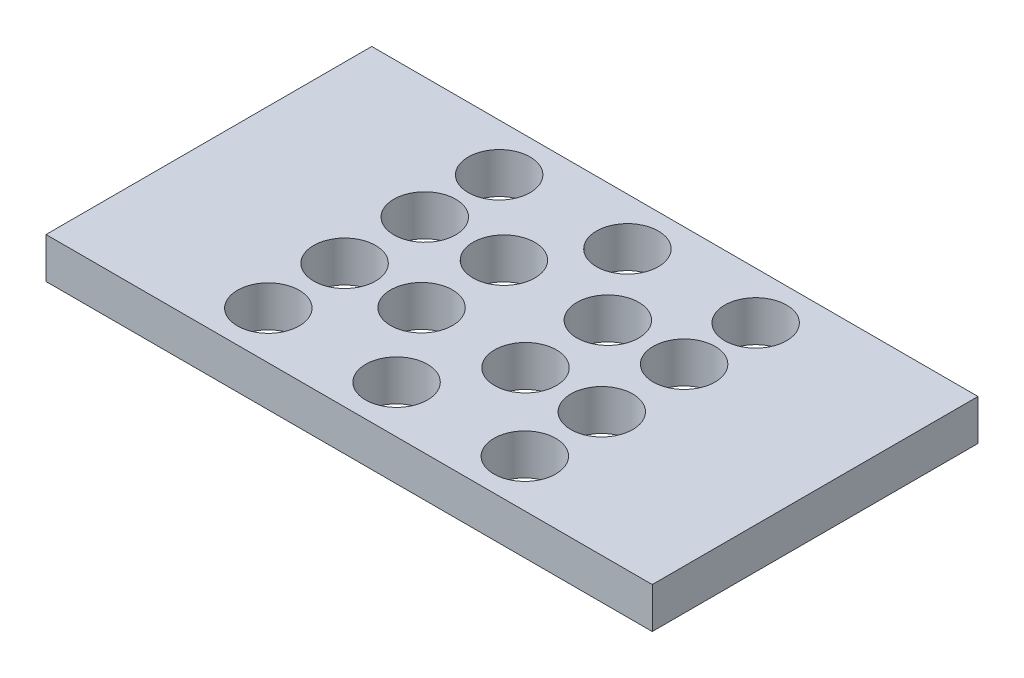
ISO-10303-21;
HEADER;
FILE_DESCRIPTION(('STEP AP214'),'2;1');
FILE_NAME('part.step','',(''),(''),'','','');
FILE_SCHEMA(('AUTOMOTIVE_DESIGN { 1 0 10303 214 1 1 1 1 }'));
ENDSEC;
DATA;
#1=APPLICATION_CONTEXT('core data for automotive mechanical design processes');
#2=APPLICATION_PROTOCOL_DEFINITION('international standard','automotive_design',2000,#1);
#3=PRODUCT_CONTEXT('',#1,'mechanical');
#4=PRODUCT('Part','Part','',(#3));
#5=PRODUCT_RELATED_PRODUCT_CATEGORY('part','',(#4));
#6=PRODUCT_DEFINITION_FORMATION('','',#4);
#7=PRODUCT_DEFINITION_CONTEXT('part definition',#1,'design');
#8=PRODUCT_DEFINITION('design','',#6,#7);
#9=PRODUCT_DEFINITION_SHAPE('','',#8);
#10=(LENGTH_UNIT() NAMED_UNIT(*) SI_UNIT(.MILLI.,.METRE.));
#11=(NAMED_UNIT(*) PLANE_ANGLE_UNIT() SI_UNIT($,.RADIAN.));
#12=(NAMED_UNIT(*) SI_UNIT($,.STERADIAN.) SOLID_ANGLE_UNIT());
#13=UNCERTAINTY_MEASURE_WITH_UNIT(LENGTH_MEASURE(1.E-05),#10,'distance_accuracy_value','');
#14=(GEOMETRIC_REPRESENTATION_CONTEXT(3) GLOBAL_UNCERTAINTY_ASSIGNED_CONTEXT((#13)) GLOBAL_UNIT_ASSIGNED_CONTEXT((#10,
#11,#12)) REPRESENTATION_CONTEXT('',''));
#15=CARTESIAN_POINT('',(0.,0.,0.));
#16=DIRECTION('',(0.,0.,1.));
#17=DIRECTION('',(1.,0.,0.));
#18=AXIS2_PLACEMENT_3D('',#15,#16,#17);
#19=CARTESIAN_POINT('',(0.,6.35,0.));
#20=DIRECTION('',(0.,1.,0.));
#21=DIRECTION('',(0.,0.,1.));
#22=AXIS2_PLACEMENT_3D('',#19,#20,#21);
#23=PLANE('',#22);
#24=CARTESIAN_POINT('',(8.10452389230297,6.35,-6.84402181742708));
#25=DIRECTION('',(0.,1.,0.));
#26=DIRECTION('',(0.,0.,1.));
#27=AXIS2_PLACEMENT_3D('',#24,#25,#26);
#28=CIRCLE('',#27,4.825);
#29=CARTESIAN_POINT('',(8.10452389230297,6.35,-2.01902181742708));
#30=VERTEX_POINT('',#29);
#31=EDGE_CURVE('E222',#30,#30,#28,.T.);
#32=ORIENTED_EDGE('',*,*,#31,.F.);
#33=EDGE_LOOP('',(#32));
#34=FACE_BOUND('',#33,.T.);
#35=CARTESIAN_POINT('',(-20.,6.35,18.0000000000001));
#36=DIRECTION('',(0.,1.,0.));
#37=DIRECTION('',(0.,0.,1.));
#38=AXIS2_PLACEMENT_3D('',#35,#36,#37);
#39=CIRCLE('',#38,4.825);
#40=CARTESIAN_POINT('',(-20.,6.35,22.8250000000001));
#41=VERTEX_POINT('',#40);
#42=EDGE_CURVE('E206',#41,#41,#39,.T.);
#43=ORIENTED_EDGE('',*,*,#42,.F.);
#44=EDGE_LOOP('',(#43));
#45=FACE_BOUND('',#44,.T.);
#46=CARTESIAN_POINT('',(-20.0995004391049,6.35,-6.49683650427019));
#47=DIRECTION('',(0.,1.,0.));
#48=DIRECTION('',(0.,0.,1.));
#49=AXIS2_PLACEMENT_3D('',#46,#47,#48);
#50=CIRCLE('',#49,4.825);
#51=CARTESIAN_POINT('',(-20.0995004391049,6.35,-1.67183650427019));
#52=VERTEX_POINT('',#51);
#53=EDGE_CURVE('E190',#52,#52,#50,.T.);
#54=ORIENTED_EDGE('',*,*,#53,.F.);
#55=EDGE_LOOP('',(#54));
#56=FACE_BOUND('',#55,.T.);
#57=CARTESIAN_POINT('',(20.,6.35,18.));
#58=DIRECTION('',(0.,1.,0.));
#59=DIRECTION('',(0.,0.,1.));
#60=AXIS2_PLACEMENT_3D('',#57,#58,#59);
#61=CIRCLE('',#60,4.825);
#62=CARTESIAN_POINT('',(20.,6.35,22.825));
#63=VERTEX_POINT('',#62);
#64=EDGE_CURVE('E174',#63,#63,#61,.T.);
#65=ORIENTED_EDGE('',*,*,#64,.F.);
#66=EDGE_LOOP('',(#65));
#67=FACE_BOUND('',#66,.T.);
#68=CARTESIAN_POINT('',(20.,6.35,-6.84402181742708));
#69=DIRECTION('',(0.,1.,0.));
#70=DIRECTION('',(0.,0.,1.));
#71=AXIS2_PLACEMENT_3D('',#68,#69,#70);
#72=CIRCLE('',#71,4.825);
#73=CARTESIAN_POINT('',(20.,6.35,-2.01902181742709));
#74=VERTEX_POINT('',#73);
#75=EDGE_CURVE('E158',#74,#74,#72,.T.);
#76=ORIENTED_EDGE('',*,*,#75,.F.);
#77=EDGE_LOOP('',(#76));
#78=FACE_BOUND('',#77,.T.);
#79=CARTESIAN_POINT('',(0.,6.35,18.));
#80=DIRECTION('',(0.,1.,0.));
#81=DIRECTION('',(0.,0.,1.));
#82=AXIS2_PLACEMENT_3D('',#79,#80,#81);
#83=CIRCLE('',#82,4.825);
#84=CARTESIAN_POINT('',(0.,6.35,22.825));
#85=VERTEX_POINT('',#84);
#86=EDGE_CURVE('E142',#85,#85,#83,.T.);
#87=ORIENTED_EDGE('',*,*,#86,.F.);
#88=EDGE_LOOP('',(#87));
#89=FACE_BOUND('',#88,.T.);
#90=CARTESIAN_POINT('',(0.,6.35,-18.));
#91=DIRECTION('',(0.,1.,0.));
#92=DIRECTION('',(0.,0.,1.));
#93=AXIS2_PLACEMENT_3D('',#90,#91,#92);
#94=CIRCLE('',#93,4.825);
#95=CARTESIAN_POINT('',(0.,6.35,-13.175));
#96=VERTEX_POINT('',#95);
#97=EDGE_CURVE('E112',#96,#96,#94,.T.);
#98=ORIENTED_EDGE('',*,*,#97,.F.);
#99=EDGE_LOOP('',(#98));
#100=FACE_BOUND('',#99,.T.);
#101=DIRECTION('',(-1.,0.,0.));
#102=VECTOR('',#101,1.);
#103=CARTESIAN_POINT('',(-47.2724278797045,6.35,-25.4));
#104=LINE('',#103,#102);
#105=CARTESIAN_POINT('',(47.2724278797045,6.35,-25.4));
#106=VERTEX_POINT('',#105);
#107=CARTESIAN_POINT('',(-47.2724278797045,6.35,-25.4));
#108=VERTEX_POINT('',#107);
#109=EDGE_CURVE('E92',#106,#108,#104,.T.);
#110=ORIENTED_EDGE('',*,*,#109,.T.);
#111=DIRECTION('',(0.,0.,1.));
#112=VECTOR('',#111,1.);
#113=CARTESIAN_POINT('',(-47.2724278797045,6.35,25.4));
#114=LINE('',#113,#112);
#115=CARTESIAN_POINT('',(-47.2724278797045,6.35,25.4));
#116=VERTEX_POINT('',#115);
#117=EDGE_CURVE('E87',#108,#116,#114,.T.);
#118=ORIENTED_EDGE('',*,*,#117,.T.);
#119=DIRECTION('',(1.,0.,0.));
#120=VECTOR('',#119,1.);
#121=CARTESIAN_POINT('',(47.2724278797045,6.35,25.4));
#122=LINE('',#121,#120);
#123=CARTESIAN_POINT('',(47.2724278797045,6.35,25.4));
#124=VERTEX_POINT('',#123);
#125=EDGE_CURVE('E90',#116,#124,#122,.T.);
#126=ORIENTED_EDGE('',*,*,#125,.T.);
#127=DIRECTION('',(0.,0.,-1.));
#128=VECTOR('',#127,1.);
#129=CARTESIAN_POINT('',(47.2724278797045,6.35,25.4));
#130=LINE('',#129,#128);
#131=EDGE_CURVE('E57',#124,#106,#130,.T.);
#132=ORIENTED_EDGE('',*,*,#131,.T.);
#133=EDGE_LOOP('',(#110,#118,#126,#132));
#134=FACE_BOUND('',#133,.T.);
#135=CARTESIAN_POINT('',(-8.10452389230297,6.35,-6.84402181742708));
#136=DIRECTION('',(0.,1.,0.));
#137=DIRECTION('',(0.,0.,1.));
#138=AXIS2_PLACEMENT_3D('',#135,#136,#137);
#139=CIRCLE('',#138,4.825);
#140=CARTESIAN_POINT('',(-8.10452389230297,6.35,-2.01902181742708));
#141=VERTEX_POINT('',#140);
#142=EDGE_CURVE('E134',#141,#141,#139,.T.);
#143=ORIENTED_EDGE('',*,*,#142,.F.);
#144=EDGE_LOOP('',(#143));
#145=FACE_BOUND('',#144,.T.);
#146=CARTESIAN_POINT('',(20.,6.35,-18.));
#147=DIRECTION('',(0.,1.,0.));
#148=DIRECTION('',(0.,0.,1.));
#149=AXIS2_PLACEMENT_3D('',#146,#147,#148);
#150=CIRCLE('',#149,4.825);
#151=CARTESIAN_POINT('',(20.,6.35,-13.175));
#152=VERTEX_POINT('',#151);
#153=EDGE_CURVE('E150',#152,#152,#150,.T.);
#154=ORIENTED_EDGE('',*,*,#153,.F.);
#155=EDGE_LOOP('',(#154));
#156=FACE_BOUND('',#155,.T.);
#157=CARTESIAN_POINT('',(20.,6.35,6.));
#158=DIRECTION('',(0.,1.,0.));
#159=DIRECTION('',(0.,0.,1.));
#160=AXIS2_PLACEMENT_3D('',#157,#158,#159);
#161=CIRCLE('',#160,4.825);
#162=CARTESIAN_POINT('',(20.,6.35,10.825));
#163=VERTEX_POINT('',#162);
#164=EDGE_CURVE('E166',#163,#163,#161,.T.);
#165=ORIENTED_EDGE('',*,*,#164,.F.);
#166=EDGE_LOOP('',(#165));
#167=FACE_BOUND('',#166,.T.);
#168=CARTESIAN_POINT('',(-20.,6.35,-17.9999999999999));
#169=DIRECTION('',(0.,1.,0.));
#170=DIRECTION('',(0.,0.,1.));
#171=AXIS2_PLACEMENT_3D('',#168,#169,#170);
#172=CIRCLE('',#171,4.825);
#173=CARTESIAN_POINT('',(-20.,6.35,-13.1749999999999));
#174=VERTEX_POINT('',#173);
#175=EDGE_CURVE('E182',#174,#174,#172,.T.);
#176=ORIENTED_EDGE('',*,*,#175,.F.);
#177=EDGE_LOOP('',(#176));
#178=FACE_BOUND('',#177,.T.);
#179=CARTESIAN_POINT('',(-20.104523892303,6.35,6.00000000000013));
#180=DIRECTION('',(0.,1.,0.));
#181=DIRECTION('',(0.,0.,1.));
#182=AXIS2_PLACEMENT_3D('',#179,#180,#181);
#183=CIRCLE('',#182,4.825);
#184=CARTESIAN_POINT('',(-20.104523892303,6.35,10.8250000000001));
#185=VERTEX_POINT('',#184);
#186=EDGE_CURVE('E198',#185,#185,#183,.T.);
#187=ORIENTED_EDGE('',*,*,#186,.F.);
#188=EDGE_LOOP('',(#187));
#189=FACE_BOUND('',#188,.T.);
#190=CARTESIAN_POINT('',(-8.10452389230297,6.35,6.00000000000013));
#191=DIRECTION('',(0.,1.,0.));
#192=DIRECTION('',(0.,0.,1.));
#193=AXIS2_PLACEMENT_3D('',#190,#191,#192);
#194=CIRCLE('',#193,4.825);
#195=CARTESIAN_POINT('',(-8.10452389230297,6.35,10.8250000000001));
#196=VERTEX_POINT('',#195);
#197=EDGE_CURVE('E214',#196,#196,#194,.T.);
#198=ORIENTED_EDGE('',*,*,#197,.F.);
#199=EDGE_LOOP('',(#198));
#200=FACE_BOUND('',#199,.T.);
#201=CARTESIAN_POINT('',(8.10452389230297,6.35,6.00000000000013));
#202=DIRECTION('',(0.,1.,0.));
#203=DIRECTION('',(0.,0.,1.));
#204=AXIS2_PLACEMENT_3D('',#201,#202,#203);
#205=CIRCLE('',#204,4.825);
#206=CARTESIAN_POINT('',(8.10452389230297,6.35,10.8250000000001));
#207=VERTEX_POINT('',#206);
#208=EDGE_CURVE('E230',#207,#207,#205,.T.);
#209=ORIENTED_EDGE('',*,*,#208,.F.);
#210=EDGE_LOOP('',(#209));
#211=FACE_BOUND('',#210,.T.);
#212=ADVANCED_FACE('F39',(#34,#45,#56,#67,#78,#89,#100,#134,#145,#156,#167,#178,#189,#200,#211),
#23,.T.);
#213=CARTESIAN_POINT('',(0.,0.,0.));
#214=DIRECTION('',(0.,1.,0.));
#215=DIRECTION('',(0.,0.,1.));
#216=AXIS2_PLACEMENT_3D('',#213,#214,#215);
#217=PLANE('',#216);
#218=DIRECTION('',(-1.,0.,0.));
#219=VECTOR('',#218,1.);
#220=CARTESIAN_POINT('',(-47.2724278797045,0.,-25.4));
#221=LINE('',#220,#219);
#222=CARTESIAN_POINT('',(47.2724278797045,0.,-25.4));
#223=VERTEX_POINT('',#222);
#224=CARTESIAN_POINT('',(-47.2724278797045,0.,-25.4));
#225=VERTEX_POINT('',#224);
#226=EDGE_CURVE('E108',#223,#225,#221,.T.);
#227=ORIENTED_EDGE('',*,*,#226,.F.);
#228=DIRECTION('',(0.,0.,-1.));
#229=VECTOR('',#228,1.);
#230=CARTESIAN_POINT('',(47.2724278797045,0.,25.4));
#231=LINE('',#230,#229);
#232=CARTESIAN_POINT('',(47.2724278797045,0.,25.4));
#233=VERTEX_POINT('',#232);
#234=EDGE_CURVE('E80',#233,#223,#231,.T.);
#235=ORIENTED_EDGE('',*,*,#234,.F.);
#236=DIRECTION('',(1.,0.,0.));
#237=VECTOR('',#236,1.);
#238=CARTESIAN_POINT('',(47.2724278797045,0.,25.4));
#239=LINE('',#238,#237);
#240=CARTESIAN_POINT('',(-47.2724278797045,0.,25.4));
#241=VERTEX_POINT('',#240);
#242=EDGE_CURVE('E74',#241,#233,#239,.T.);
#243=ORIENTED_EDGE('',*,*,#242,.F.);
#244=DIRECTION('',(0.,0.,1.));
#245=VECTOR('',#244,1.);
#246=CARTESIAN_POINT('',(-47.2724278797045,0.,25.4));
#247=LINE('',#246,#245);
#248=EDGE_CURVE('E97',#225,#241,#247,.T.);
#249=ORIENTED_EDGE('',*,*,#248,.F.);
#250=EDGE_LOOP('',(#227,#235,#243,#249));
#251=FACE_BOUND('',#250,.T.);
#252=CARTESIAN_POINT('',(0.,0.,-18.));
#253=DIRECTION('',(0.,1.,0.));
#254=DIRECTION('',(0.,0.,1.));
#255=AXIS2_PLACEMENT_3D('',#252,#253,#254);
#256=CIRCLE('',#255,4.825);
#257=CARTESIAN_POINT('',(0.,0.,-13.175));
#258=VERTEX_POINT('',#257);
#259=EDGE_CURVE('E130',#258,#258,#256,.T.);
#260=ORIENTED_EDGE('',*,*,#259,.T.);
#261=EDGE_LOOP('',(#260));
#262=FACE_BOUND('',#261,.T.);
#263=CARTESIAN_POINT('',(-8.10452389230297,0.,-6.84402181742708));
#264=DIRECTION('',(0.,1.,0.));
#265=DIRECTION('',(0.,0.,1.));
#266=AXIS2_PLACEMENT_3D('',#263,#264,#265);
#267=CIRCLE('',#266,4.825);
#268=CARTESIAN_POINT('',(-8.10452389230297,0.,-2.01902181742708));
#269=VERTEX_POINT('',#268);
#270=EDGE_CURVE('E138',#269,#269,#267,.T.);
#271=ORIENTED_EDGE('',*,*,#270,.T.);
#272=EDGE_LOOP('',(#271));
#273=FACE_BOUND('',#272,.T.);
#274=CARTESIAN_POINT('',(0.,0.,18.));
#275=DIRECTION('',(0.,1.,0.));
#276=DIRECTION('',(0.,0.,1.));
#277=AXIS2_PLACEMENT_3D('',#274,#275,#276);
#278=CIRCLE('',#277,4.825);
#279=CARTESIAN_POINT('',(0.,0.,22.825));
#280=VERTEX_POINT('',#279);
#281=EDGE_CURVE('E146',#280,#280,#278,.T.);
#282=ORIENTED_EDGE('',*,*,#281,.T.);
#283=EDGE_LOOP('',(#282));
#284=FACE_BOUND('',#283,.T.);
#285=CARTESIAN_POINT('',(20.,0.,-18.));
#286=DIRECTION('',(0.,1.,0.));
#287=DIRECTION('',(0.,0.,1.));
#288=AXIS2_PLACEMENT_3D('',#285,#286,#287);
#289=CIRCLE('',#288,4.825);
#290=CARTESIAN_POINT('',(20.,0.,-13.175));
#291=VERTEX_POINT('',#290);
#292=EDGE_CURVE('E154',#291,#291,#289,.T.);
#293=ORIENTED_EDGE('',*,*,#292,.T.);
#294=EDGE_LOOP('',(#293));
#295=FACE_BOUND('',#294,.T.);
#296=CARTESIAN_POINT('',(20.,0.,-6.84402181742708));
#297=DIRECTION('',(0.,1.,0.));
#298=DIRECTION('',(0.,0.,1.));
#299=AXIS2_PLACEMENT_3D('',#296,#297,#298);
#300=CIRCLE('',#299,4.825);
#301=CARTESIAN_POINT('',(20.,0.,-2.01902181742709));
#302=VERTEX_POINT('',#301);
#303=EDGE_CURVE('E162',#302,#302,#300,.T.);
#304=ORIENTED_EDGE('',*,*,#303,.T.);
#305=EDGE_LOOP('',(#304));
#306=FACE_BOUND('',#305,.T.);
#307=CARTESIAN_POINT('',(20.,0.,6.));
#308=DIRECTION('',(0.,1.,0.));
#309=DIRECTION('',(0.,0.,1.));
#310=AXIS2_PLACEMENT_3D('',#307,#308,#309);
#311=CIRCLE('',#310,4.825);
#312=CARTESIAN_POINT('',(20.,0.,10.825));
#313=VERTEX_POINT('',#312);
#314=EDGE_CURVE('E170',#313,#313,#311,.T.);
#315=ORIENTED_EDGE('',*,*,#314,.T.);
#316=EDGE_LOOP('',(#315));
#317=FACE_BOUND('',#316,.T.);
#318=CARTESIAN_POINT('',(20.,0.,18.));
#319=DIRECTION('',(0.,1.,0.));
#320=DIRECTION('',(0.,0.,1.));
#321=AXIS2_PLACEMENT_3D('',#318,#319,#320);
#322=CIRCLE('',#321,4.825);
#323=CARTESIAN_POINT('',(20.,0.,22.825));
#324=VERTEX_POINT('',#323);
#325=EDGE_CURVE('E178',#324,#324,#322,.T.);
#326=ORIENTED_EDGE('',*,*,#325,.T.);
#327=EDGE_LOOP('',(#326));
#328=FACE_BOUND('',#327,.T.);
#329=CARTESIAN_POINT('',(-20.,0.,-17.9999999999999));
#330=DIRECTION('',(0.,1.,0.));
#331=DIRECTION('',(0.,0.,1.));
#332=AXIS2_PLACEMENT_3D('',#329,#330,#331);
#333=CIRCLE('',#332,4.825);
#334=CARTESIAN_POINT('',(-20.,0.,-13.1749999999999));
#335=VERTEX_POINT('',#334);
#336=EDGE_CURVE('E186',#335,#335,#333,.T.);
#337=ORIENTED_EDGE('',*,*,#336,.T.);
#338=EDGE_LOOP('',(#337));
#339=FACE_BOUND('',#338,.T.);
#340=CARTESIAN_POINT('',(-20.0995004391049,0.,-6.49683650427019));
#341=DIRECTION('',(0.,1.,0.));
#342=DIRECTION('',(0.,0.,1.));
#343=AXIS2_PLACEMENT_3D('',#340,#341,#342);
#344=CIRCLE('',#343,4.825);
#345=CARTESIAN_POINT('',(-20.0995004391049,0.,-1.67183650427019));
#346=VERTEX_POINT('',#345);
#347=EDGE_CURVE('E194',#346,#346,#344,.T.);
#348=ORIENTED_EDGE('',*,*,#347,.T.);
#349=EDGE_LOOP('',(#348));
#350=FACE_BOUND('',#349,.T.);
#351=CARTESIAN_POINT('',(-20.104523892303,0.,6.00000000000013));
#352=DIRECTION('',(0.,1.,0.));
#353=DIRECTION('',(0.,0.,1.));
#354=AXIS2_PLACEMENT_3D('',#351,#352,#353);
#355=CIRCLE('',#354,4.825);
#356=CARTESIAN_POINT('',(-20.104523892303,0.,10.8250000000001));
#357=VERTEX_POINT('',#356);
#358=EDGE_CURVE('E202',#357,#357,#355,.T.);
#359=ORIENTED_EDGE('',*,*,#358,.T.);
#360=EDGE_LOOP('',(#359));
#361=FACE_BOUND('',#360,.T.);
#362=CARTESIAN_POINT('',(-20.,0.,18.0000000000001));
#363=DIRECTION('',(0.,1.,0.));
#364=DIRECTION('',(0.,0.,1.));
#365=AXIS2_PLACEMENT_3D('',#362,#363,#364);
#366=CIRCLE('',#365,4.825);
#367=CARTESIAN_POINT('',(-20.,0.,22.8250000000001));
#368=VERTEX_POINT('',#367);
#369=EDGE_CURVE('E210',#368,#368,#366,.T.);
#370=ORIENTED_EDGE('',*,*,#369,.T.);
#371=EDGE_LOOP('',(#370));
#372=FACE_BOUND('',#371,.T.);
#373=CARTESIAN_POINT('',(-8.10452389230297,0.,6.00000000000013));
#374=DIRECTION('',(0.,1.,0.));
#375=DIRECTION('',(0.,0.,1.));
#376=AXIS2_PLACEMENT_3D('',#373,#374,#375);
#377=CIRCLE('',#376,4.825);
#378=CARTESIAN_POINT('',(-8.10452389230297,0.,10.8250000000001));
#379=VERTEX_POINT('',#378);
#380=EDGE_CURVE('E218',#379,#379,#377,.T.);
#381=ORIENTED_EDGE('',*,*,#380,.T.);
#382=EDGE_LOOP('',(#381));
#383=FACE_BOUND('',#382,.T.);
#384=CARTESIAN_POINT('',(8.10452389230297,0.,-6.84402181742708));
#385=DIRECTION('',(0.,1.,0.));
#386=DIRECTION('',(0.,0.,1.));
#387=AXIS2_PLACEMENT_3D('',#384,#385,#386);
#388=CIRCLE('',#387,4.825);
#389=CARTESIAN_POINT('',(8.10452389230297,0.,-2.01902181742708));
#390=VERTEX_POINT('',#389);
#391=EDGE_CURVE('E226',#390,#390,#388,.T.);
#392=ORIENTED_EDGE('',*,*,#391,.T.);
#393=EDGE_LOOP('',(#392));
#394=FACE_BOUND('',#393,.T.);
#395=CARTESIAN_POINT('',(8.10452389230297,0.,6.00000000000013));
#396=DIRECTION('',(0.,1.,0.));
#397=DIRECTION('',(0.,0.,1.));
#398=AXIS2_PLACEMENT_3D('',#395,#396,#397);
#399=CIRCLE('',#398,4.825);
#400=CARTESIAN_POINT('',(8.10452389230297,0.,10.8250000000001));
#401=VERTEX_POINT('',#400);
#402=EDGE_CURVE('E234',#401,#401,#399,.T.);
#403=ORIENTED_EDGE('',*,*,#402,.T.);
#404=EDGE_LOOP('',(#403));
#405=FACE_BOUND('',#404,.T.);
#406=ADVANCED_FACE('F125',(#251,#262,#273,#284,#295,#306,#317,#328,#339,#350,#361,#372,#383,
#394,#405),#217,.F.);
#407=CARTESIAN_POINT('',(-47.2724278797045,6.35,-25.4));
#408=DIRECTION('',(0.,0.,1.));
#409=DIRECTION('',(1.,0.,0.));
#410=AXIS2_PLACEMENT_3D('',#407,#408,#409);
#411=PLANE('',#410);
#412=ORIENTED_EDGE('',*,*,#226,.T.);
#413=DIRECTION('',(0.,-1.,0.));
#414=VECTOR('',#413,1.);
#415=CARTESIAN_POINT('',(-47.2724278797045,6.35,-25.4));
#416=LINE('',#415,#414);
#417=EDGE_CURVE('E11',#108,#225,#416,.T.);
#418=ORIENTED_EDGE('',*,*,#417,.F.);
#419=ORIENTED_EDGE('',*,*,#109,.F.);
#420=DIRECTION('',(0.,-1.,0.));
#421=VECTOR('',#420,1.);
#422=CARTESIAN_POINT('',(47.2724278797045,6.35,-25.4));
#423=LINE('',#422,#421);
#424=EDGE_CURVE('E104',#106,#223,#423,.T.);
#425=ORIENTED_EDGE('',*,*,#424,.T.);
#426=EDGE_LOOP('',(#412,#418,#419,#425));
#427=FACE_BOUND('',#426,.T.);
#428=ADVANCED_FACE('F41',(#427),#411,.F.);
#429=CARTESIAN_POINT('',(-47.2724278797045,6.35,25.4));
#430=DIRECTION('',(1.,0.,0.));
#431=DIRECTION('',(0.,0.,-1.));
#432=AXIS2_PLACEMENT_3D('',#429,#430,#431);
#433=PLANE('',#432);
#434=ORIENTED_EDGE('',*,*,#248,.T.);
#435=DIRECTION('',(0.,-1.,0.));
#436=VECTOR('',#435,1.);
#437=CARTESIAN_POINT('',(-47.2724278797045,6.35,25.4));
#438=LINE('',#437,#436);
#439=EDGE_CURVE('E49',#116,#241,#438,.T.);
#440=ORIENTED_EDGE('',*,*,#439,.F.);
#441=ORIENTED_EDGE('',*,*,#117,.F.);
#442=ORIENTED_EDGE('',*,*,#417,.T.);
#443=EDGE_LOOP('',(#434,#440,#441,#442));
#444=FACE_BOUND('',#443,.T.);
#445=ADVANCED_FACE('F96',(#444),#433,.F.);
#446=CARTESIAN_POINT('',(47.2724278797045,6.35,25.4));
#447=DIRECTION('',(0.,0.,-1.));
#448=DIRECTION('',(-1.,0.,0.));
#449=AXIS2_PLACEMENT_3D('',#446,#447,#448);
#450=PLANE('',#449);
#451=ORIENTED_EDGE('',*,*,#242,.T.);
#452=DIRECTION('',(0.,-1.,0.));
#453=VECTOR('',#452,1.);
#454=CARTESIAN_POINT('',(47.2724278797045,6.35,25.4));
#455=LINE('',#454,#453);
#456=EDGE_CURVE('E99',#124,#233,#455,.T.);
#457=ORIENTED_EDGE('',*,*,#456,.F.);
#458=ORIENTED_EDGE('',*,*,#125,.F.);
#459=ORIENTED_EDGE('',*,*,#439,.T.);
#460=EDGE_LOOP('',(#451,#457,#458,#459));
#461=FACE_BOUND('',#460,.T.);
#462=ADVANCED_FACE('F100',(#461),#450,.F.);
#463=CARTESIAN_POINT('',(47.2724278797045,6.35,25.4));
#464=DIRECTION('',(-1.,0.,0.));
#465=DIRECTION('',(0.,0.,1.));
#466=AXIS2_PLACEMENT_3D('',#463,#464,#465);
#467=PLANE('',#466);
#468=ORIENTED_EDGE('',*,*,#234,.T.);
#469=ORIENTED_EDGE('',*,*,#424,.F.);
#470=ORIENTED_EDGE('',*,*,#131,.F.);
#471=ORIENTED_EDGE('',*,*,#456,.T.);
#472=EDGE_LOOP('',(#468,#469,#470,#471));
#473=FACE_BOUND('',#472,.T.);
#474=ADVANCED_FACE('F122',(#473),#467,.F.);
#475=CARTESIAN_POINT('',(0.,6.35,-18.));
#476=DIRECTION('',(0.,-1.,0.));
#477=DIRECTION('',(0.,0.,-1.));
#478=AXIS2_PLACEMENT_3D('',#475,#476,#477);
#479=CYLINDRICAL_SURFACE('',#478,4.825);
#480=ORIENTED_EDGE('',*,*,#97,.T.);
#481=EDGE_LOOP('',(#480));
#482=FACE_BOUND('',#481,.T.);
#483=ORIENTED_EDGE('',*,*,#259,.F.);
#484=EDGE_LOOP('',(#483));
#485=FACE_BOUND('',#484,.T.);
#486=ADVANCED_FACE('F255',(#482,#485),#479,.F.);
#487=CARTESIAN_POINT('',(-8.10452389230297,6.35,-6.84402181742708));
#488=DIRECTION('',(0.,-1.,0.));
#489=DIRECTION('',(0.,0.,-1.));
#490=AXIS2_PLACEMENT_3D('',#487,#488,#489);
#491=CYLINDRICAL_SURFACE('',#490,4.825);
#492=ORIENTED_EDGE('',*,*,#142,.T.);
#493=EDGE_LOOP('',(#492));
#494=FACE_BOUND('',#493,.T.);
#495=ORIENTED_EDGE('',*,*,#270,.F.);
#496=EDGE_LOOP('',(#495));
#497=FACE_BOUND('',#496,.T.);
#498=ADVANCED_FACE('F301',(#494,#497),#491,.F.);
#499=CARTESIAN_POINT('',(0.,6.35,18.));
#500=DIRECTION('',(0.,-1.,0.));
#501=DIRECTION('',(0.,0.,-1.));
#502=AXIS2_PLACEMENT_3D('',#499,#500,#501);
#503=CYLINDRICAL_SURFACE('',#502,4.825);
#504=ORIENTED_EDGE('',*,*,#86,.T.);
#505=EDGE_LOOP('',(#504));
#506=FACE_BOUND('',#505,.T.);
#507=ORIENTED_EDGE('',*,*,#281,.F.);
#508=EDGE_LOOP('',(#507));
#509=FACE_BOUND('',#508,.T.);
#510=ADVANCED_FACE('F309',(#506,#509),#503,.F.);
#511=CARTESIAN_POINT('',(20.,6.35,-18.));
#512=DIRECTION('',(0.,-1.,0.));
#513=DIRECTION('',(0.,0.,-1.));
#514=AXIS2_PLACEMENT_3D('',#511,#512,#513);
#515=CYLINDRICAL_SURFACE('',#514,4.825);
#516=ORIENTED_EDGE('',*,*,#153,.T.);
#517=EDGE_LOOP('',(#516));
#518=FACE_BOUND('',#517,.T.);
#519=ORIENTED_EDGE('',*,*,#292,.F.);
#520=EDGE_LOOP('',(#519));
#521=FACE_BOUND('',#520,.T.);
#522=ADVANCED_FACE('F317',(#518,#521),#515,.F.);
#523=CARTESIAN_POINT('',(20.,6.35,-6.84402181742708));
#524=DIRECTION('',(0.,-1.,0.));
#525=DIRECTION('',(0.,0.,-1.));
#526=AXIS2_PLACEMENT_3D('',#523,#524,#525);
#527=CYLINDRICAL_SURFACE('',#526,4.825);
#528=ORIENTED_EDGE('',*,*,#75,.T.);
#529=EDGE_LOOP('',(#528));
#530=FACE_BOUND('',#529,.T.);
#531=ORIENTED_EDGE('',*,*,#303,.F.);
#532=EDGE_LOOP('',(#531));
#533=FACE_BOUND('',#532,.T.);
#534=ADVANCED_FACE('F326',(#530,#533),#527,.F.);
#535=CARTESIAN_POINT('',(20.,6.35,6.));
#536=DIRECTION('',(0.,-1.,0.));
#537=DIRECTION('',(0.,0.,-1.));
#538=AXIS2_PLACEMENT_3D('',#535,#536,#537);
#539=CYLINDRICAL_SURFACE('',#538,4.825);
#540=ORIENTED_EDGE('',*,*,#164,.T.);
#541=EDGE_LOOP('',(#540));
#542=FACE_BOUND('',#541,.T.);
#543=ORIENTED_EDGE('',*,*,#314,.F.);
#544=EDGE_LOOP('',(#543));
#545=FACE_BOUND('',#544,.T.);
#546=ADVANCED_FACE('F335',(#542,#545),#539,.F.);
#547=CARTESIAN_POINT('',(20.,6.35,18.));
#548=DIRECTION('',(0.,-1.,0.));
#549=DIRECTION('',(0.,0.,-1.));
#550=AXIS2_PLACEMENT_3D('',#547,#548,#549);
#551=CYLINDRICAL_SURFACE('',#550,4.825);
#552=ORIENTED_EDGE('',*,*,#64,.T.);
#553=EDGE_LOOP('',(#552));
#554=FACE_BOUND('',#553,.T.);
#555=ORIENTED_EDGE('',*,*,#325,.F.);
#556=EDGE_LOOP('',(#555));
#557=FACE_BOUND('',#556,.T.);
#558=ADVANCED_FACE('F344',(#554,#557),#551,.F.);
#559=CARTESIAN_POINT('',(-20.,6.35,-17.9999999999999));
#560=DIRECTION('',(0.,-1.,0.));
#561=DIRECTION('',(0.,0.,-1.));
#562=AXIS2_PLACEMENT_3D('',#559,#560,#561);
#563=CYLINDRICAL_SURFACE('',#562,4.825);
#564=ORIENTED_EDGE('',*,*,#175,.T.);
#565=EDGE_LOOP('',(#564));
#566=FACE_BOUND('',#565,.T.);
#567=ORIENTED_EDGE('',*,*,#336,.F.);
#568=EDGE_LOOP('',(#567));
#569=FACE_BOUND('',#568,.T.);
#570=ADVANCED_FACE('F353',(#566,#569),#563,.F.);
#571=CARTESIAN_POINT('',(-20.0995004391049,6.35,-6.49683650427019));
#572=DIRECTION('',(0.,-1.,0.));
#573=DIRECTION('',(0.,0.,-1.));
#574=AXIS2_PLACEMENT_3D('',#571,#572,#573);
#575=CYLINDRICAL_SURFACE('',#574,4.825);
#576=ORIENTED_EDGE('',*,*,#53,.T.);
#577=EDGE_LOOP('',(#576));
#578=FACE_BOUND('',#577,.T.);
#579=ORIENTED_EDGE('',*,*,#347,.F.);
#580=EDGE_LOOP('',(#579));
#581=FACE_BOUND('',#580,.T.);
#582=ADVANCED_FACE('F362',(#578,#581),#575,.F.);
#583=CARTESIAN_POINT('',(-20.104523892303,6.35,6.00000000000013));
#584=DIRECTION('',(0.,-1.,0.));
#585=DIRECTION('',(0.,0.,-1.));
#586=AXIS2_PLACEMENT_3D('',#583,#584,#585);
#587=CYLINDRICAL_SURFACE('',#586,4.825);
#588=ORIENTED_EDGE('',*,*,#186,.T.);
#589=EDGE_LOOP('',(#588));
#590=FACE_BOUND('',#589,.T.);
#591=ORIENTED_EDGE('',*,*,#358,.F.);
#592=EDGE_LOOP('',(#591));
#593=FACE_BOUND('',#592,.T.);
#594=ADVANCED_FACE('F371',(#590,#593),#587,.F.);
#595=CARTESIAN_POINT('',(-20.,6.35,18.0000000000001));
#596=DIRECTION('',(0.,-1.,0.));
#597=DIRECTION('',(0.,0.,-1.));
#598=AXIS2_PLACEMENT_3D('',#595,#596,#597);
#599=CYLINDRICAL_SURFACE('',#598,4.825);
#600=ORIENTED_EDGE('',*,*,#42,.T.);
#601=EDGE_LOOP('',(#600));
#602=FACE_BOUND('',#601,.T.);
#603=ORIENTED_EDGE('',*,*,#369,.F.);
#604=EDGE_LOOP('',(#603));
#605=FACE_BOUND('',#604,.T.);
#606=ADVANCED_FACE('F380',(#602,#605),#599,.F.);
#607=CARTESIAN_POINT('',(-8.10452389230297,6.35,6.00000000000013));
#608=DIRECTION('',(0.,-1.,0.));
#609=DIRECTION('',(0.,0.,-1.));
#610=AXIS2_PLACEMENT_3D('',#607,#608,#609);
#611=CYLINDRICAL_SURFACE('',#610,4.825);
#612=ORIENTED_EDGE('',*,*,#197,.T.);
#613=EDGE_LOOP('',(#612));
#614=FACE_BOUND('',#613,.T.);
#615=ORIENTED_EDGE('',*,*,#380,.F.);
#616=EDGE_LOOP('',(#615));
#617=FACE_BOUND('',#616,.T.);
#618=ADVANCED_FACE('F389',(#614,#617),#611,.F.);
#619=CARTESIAN_POINT('',(8.10452389230297,6.35,-6.84402181742708));
#620=DIRECTION('',(0.,-1.,0.));
#621=DIRECTION('',(0.,0.,-1.));
#622=AXIS2_PLACEMENT_3D('',#619,#620,#621);
#623=CYLINDRICAL_SURFACE('',#622,4.825);
#624=ORIENTED_EDGE('',*,*,#31,.T.);
#625=EDGE_LOOP('',(#624));
#626=FACE_BOUND('',#625,.T.);
#627=ORIENTED_EDGE('',*,*,#391,.F.);
#628=EDGE_LOOP('',(#627));
#629=FACE_BOUND('',#628,.T.);
#630=ADVANCED_FACE('F398',(#626,#629),#623,.F.);
#631=CARTESIAN_POINT('',(8.10452389230297,6.35,6.00000000000013));
#632=DIRECTION('',(0.,-1.,0.));
#633=DIRECTION('',(0.,0.,-1.));
#634=AXIS2_PLACEMENT_3D('',#631,#632,#633);
#635=CYLINDRICAL_SURFACE('',#634,4.825);
#636=ORIENTED_EDGE('',*,*,#208,.T.);
#637=EDGE_LOOP('',(#636));
#638=FACE_BOUND('',#637,.T.);
#639=ORIENTED_EDGE('',*,*,#402,.F.);
#640=EDGE_LOOP('',(#639));
#641=FACE_BOUND('',#640,.T.);
#642=ADVANCED_FACE('F242',(#638,#641),#635,.F.);
#643=CLOSED_SHELL('',(#212,#406,#428,#445,#462,#474,#486,#498,#510,#522,#534,#546,#558,#570,
#582,#594,#606,#618,#630,#642));
#644=MANIFOLD_SOLID_BREP('B2',#643);
#645=ADVANCED_BREP_SHAPE_REPRESENTATION('',(#18,#644),#14);
#646=SHAPE_DEFINITION_REPRESENTATION(#9,#645);
ENDSEC;
END-ISO-10303-21;
